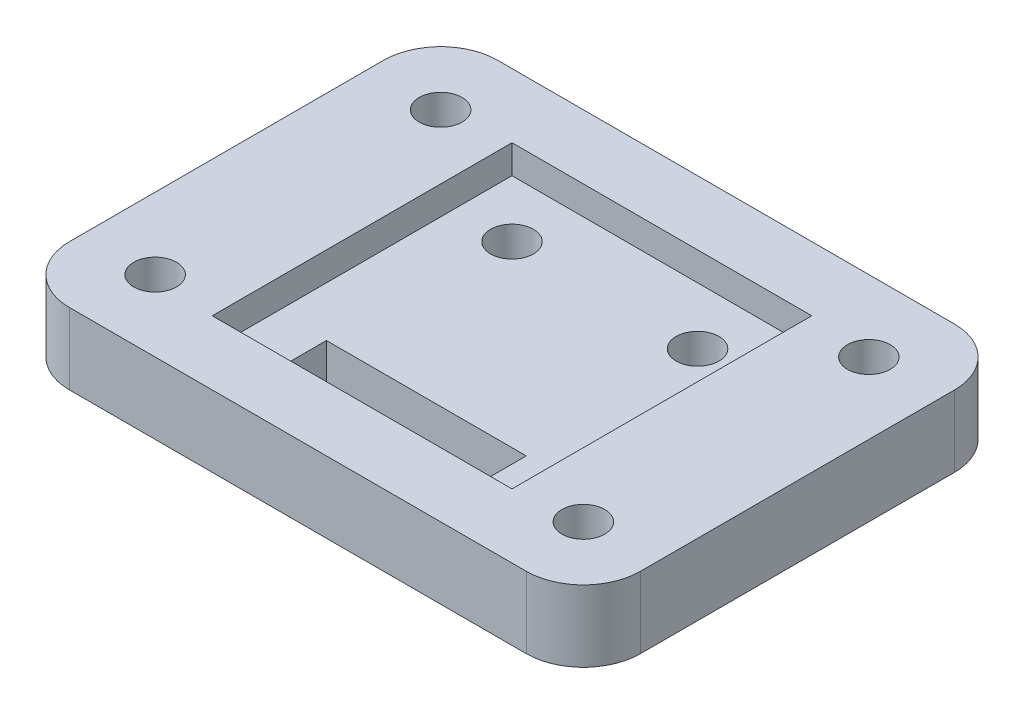
ISO-10303-21;
HEADER;
FILE_DESCRIPTION(('STEP AP214'),'2;1');
FILE_NAME('part.step','',(''),(''),'','','');
FILE_SCHEMA(('AUTOMOTIVE_DESIGN { 1 0 10303 214 1 1 1 1 }'));
ENDSEC;
DATA;
#1=APPLICATION_CONTEXT('core data for automotive mechanical design processes');
#2=APPLICATION_PROTOCOL_DEFINITION('international standard','automotive_design',2000,#1);
#3=PRODUCT_CONTEXT('',#1,'mechanical');
#4=PRODUCT('Part','Part','',(#3));
#5=PRODUCT_RELATED_PRODUCT_CATEGORY('part','',(#4));
#6=PRODUCT_DEFINITION_FORMATION('','',#4);
#7=PRODUCT_DEFINITION_CONTEXT('part definition',#1,'design');
#8=PRODUCT_DEFINITION('design','',#6,#7);
#9=PRODUCT_DEFINITION_SHAPE('','',#8);
#10=(LENGTH_UNIT() NAMED_UNIT(*) SI_UNIT(.MILLI.,.METRE.));
#11=(NAMED_UNIT(*) PLANE_ANGLE_UNIT() SI_UNIT($,.RADIAN.));
#12=(NAMED_UNIT(*) SI_UNIT($,.STERADIAN.) SOLID_ANGLE_UNIT());
#13=UNCERTAINTY_MEASURE_WITH_UNIT(LENGTH_MEASURE(1.E-05),#10,'distance_accuracy_value','');
#14=(GEOMETRIC_REPRESENTATION_CONTEXT(3) GLOBAL_UNCERTAINTY_ASSIGNED_CONTEXT((#13)) GLOBAL_UNIT_ASSIGNED_CONTEXT((#10,
#11,#12)) REPRESENTATION_CONTEXT('',''));
#15=CARTESIAN_POINT('',(0.,0.,0.));
#16=DIRECTION('',(0.,0.,1.));
#17=DIRECTION('',(1.,0.,0.));
#18=AXIS2_PLACEMENT_3D('',#15,#16,#17);
#19=CARTESIAN_POINT('',(0.,5.,0.));
#20=DIRECTION('',(1.,0.,0.));
#21=DIRECTION('',(0.,0.,-1.));
#22=AXIS2_PLACEMENT_3D('',#19,#20,#21);
#23=PLANE('',#22);
#24=DIRECTION('',(0.,0.,1.));
#25=VECTOR('',#24,1.);
#26=CARTESIAN_POINT('',(0.,5.,0.));
#27=LINE('',#26,#25);
#28=CARTESIAN_POINT('',(0.,5.,-26.));
#29=VERTEX_POINT('',#28);
#30=CARTESIAN_POINT('',(0.,5.,-4.));
#31=VERTEX_POINT('',#30);
#32=EDGE_CURVE('E220',#29,#31,#27,.T.);
#33=ORIENTED_EDGE('',*,*,#32,.F.);
#34=DIRECTION('',(0.,-1.,0.));
#35=VECTOR('',#34,1.);
#36=CARTESIAN_POINT('',(0.,5.,-26.));
#37=LINE('',#36,#35);
#38=CARTESIAN_POINT('',(0.,0.,-26.));
#39=VERTEX_POINT('',#38);
#40=EDGE_CURVE('E11',#29,#39,#37,.T.);
#41=ORIENTED_EDGE('',*,*,#40,.T.);
#42=DIRECTION('',(0.,0.,1.));
#43=VECTOR('',#42,1.);
#44=CARTESIAN_POINT('',(0.,0.,0.));
#45=LINE('',#44,#43);
#46=CARTESIAN_POINT('',(0.,0.,-4.));
#47=VERTEX_POINT('',#46);
#48=EDGE_CURVE('E213',#39,#47,#45,.T.);
#49=ORIENTED_EDGE('',*,*,#48,.T.);
#50=DIRECTION('',(0.,-1.,0.));
#51=VECTOR('',#50,1.);
#52=CARTESIAN_POINT('',(0.,5.,-4.));
#53=LINE('',#52,#51);
#54=EDGE_CURVE('E40',#47,#31,#53,.F.);
#55=ORIENTED_EDGE('',*,*,#54,.T.);
#56=EDGE_LOOP('',(#33,#41,#49,#55));
#57=FACE_BOUND('',#56,.T.);
#58=ADVANCED_FACE('F32',(#57),#23,.F.);
#59=CARTESIAN_POINT('',(0.,5.,0.));
#60=DIRECTION('',(0.,0.,-1.));
#61=DIRECTION('',(-1.,0.,0.));
#62=AXIS2_PLACEMENT_3D('',#59,#60,#61);
#63=PLANE('',#62);
#64=DIRECTION('',(1.,0.,0.));
#65=VECTOR('',#64,1.);
#66=CARTESIAN_POINT('',(0.,0.,0.));
#67=LINE('',#66,#65);
#68=CARTESIAN_POINT('',(4.,0.,0.));
#69=VERTEX_POINT('',#68);
#70=CARTESIAN_POINT('',(36.,0.,0.));
#71=VERTEX_POINT('',#70);
#72=EDGE_CURVE('E234',#69,#71,#67,.T.);
#73=ORIENTED_EDGE('',*,*,#72,.T.);
#74=DIRECTION('',(0.,-1.,0.));
#75=VECTOR('',#74,1.);
#76=CARTESIAN_POINT('',(36.,5.,0.));
#77=LINE('',#76,#75);
#78=CARTESIAN_POINT('',(36.,5.,0.));
#79=VERTEX_POINT('',#78);
#80=EDGE_CURVE('E47',#71,#79,#77,.F.);
#81=ORIENTED_EDGE('',*,*,#80,.T.);
#82=DIRECTION('',(1.,0.,0.));
#83=VECTOR('',#82,1.);
#84=CARTESIAN_POINT('',(0.,5.,0.));
#85=LINE('',#84,#83);
#86=CARTESIAN_POINT('',(4.,5.,0.));
#87=VERTEX_POINT('',#86);
#88=EDGE_CURVE('E222',#87,#79,#85,.T.);
#89=ORIENTED_EDGE('',*,*,#88,.F.);
#90=DIRECTION('',(0.,-1.,0.));
#91=VECTOR('',#90,1.);
#92=CARTESIAN_POINT('',(4.,5.,0.));
#93=LINE('',#92,#91);
#94=EDGE_CURVE('E265',#87,#69,#93,.T.);
#95=ORIENTED_EDGE('',*,*,#94,.T.);
#96=EDGE_LOOP('',(#73,#81,#89,#95));
#97=FACE_BOUND('',#96,.T.);
#98=ADVANCED_FACE('F278',(#97),#63,.F.);
#99=CARTESIAN_POINT('',(40.,5.,0.));
#100=DIRECTION('',(-1.,0.,0.));
#101=DIRECTION('',(0.,0.,1.));
#102=AXIS2_PLACEMENT_3D('',#99,#100,#101);
#103=PLANE('',#102);
#104=DIRECTION('',(0.,0.,-1.));
#105=VECTOR('',#104,1.);
#106=CARTESIAN_POINT('',(40.,0.,0.));
#107=LINE('',#106,#105);
#108=CARTESIAN_POINT('',(40.,0.,-4.));
#109=VERTEX_POINT('',#108);
#110=CARTESIAN_POINT('',(40.,0.,-26.));
#111=VERTEX_POINT('',#110);
#112=EDGE_CURVE('E236',#109,#111,#107,.T.);
#113=ORIENTED_EDGE('',*,*,#112,.T.);
#114=DIRECTION('',(0.,-1.,0.));
#115=VECTOR('',#114,1.);
#116=CARTESIAN_POINT('',(40.,5.,-26.));
#117=LINE('',#116,#115);
#118=CARTESIAN_POINT('',(40.,5.,-26.));
#119=VERTEX_POINT('',#118);
#120=EDGE_CURVE('E256',#111,#119,#117,.F.);
#121=ORIENTED_EDGE('',*,*,#120,.T.);
#122=DIRECTION('',(0.,0.,-1.));
#123=VECTOR('',#122,1.);
#124=CARTESIAN_POINT('',(40.,5.,0.));
#125=LINE('',#124,#123);
#126=CARTESIAN_POINT('',(40.,5.,-4.));
#127=VERTEX_POINT('',#126);
#128=EDGE_CURVE('E225',#127,#119,#125,.T.);
#129=ORIENTED_EDGE('',*,*,#128,.F.);
#130=DIRECTION('',(0.,-1.,0.));
#131=VECTOR('',#130,1.);
#132=CARTESIAN_POINT('',(40.,5.,-4.));
#133=LINE('',#132,#131);
#134=EDGE_CURVE('E253',#127,#109,#133,.T.);
#135=ORIENTED_EDGE('',*,*,#134,.T.);
#136=EDGE_LOOP('',(#113,#121,#129,#135));
#137=FACE_BOUND('',#136,.T.);
#138=ADVANCED_FACE('F287',(#137),#103,.F.);
#139=CARTESIAN_POINT('',(0.,5.,-30.));
#140=DIRECTION('',(0.,0.,1.));
#141=DIRECTION('',(1.,0.,0.));
#142=AXIS2_PLACEMENT_3D('',#139,#140,#141);
#143=PLANE('',#142);
#144=DIRECTION('',(-1.,0.,0.));
#145=VECTOR('',#144,1.);
#146=CARTESIAN_POINT('',(0.,5.,-30.));
#147=LINE('',#146,#145);
#148=CARTESIAN_POINT('',(36.,5.,-30.));
#149=VERTEX_POINT('',#148);
#150=CARTESIAN_POINT('',(4.,5.,-30.));
#151=VERTEX_POINT('',#150);
#152=EDGE_CURVE('E228',#149,#151,#147,.T.);
#153=ORIENTED_EDGE('',*,*,#152,.F.);
#154=DIRECTION('',(0.,-1.,0.));
#155=VECTOR('',#154,1.);
#156=CARTESIAN_POINT('',(36.,5.,-30.));
#157=LINE('',#156,#155);
#158=CARTESIAN_POINT('',(36.,0.,-30.));
#159=VERTEX_POINT('',#158);
#160=EDGE_CURVE('E242',#149,#159,#157,.T.);
#161=ORIENTED_EDGE('',*,*,#160,.T.);
#162=DIRECTION('',(-1.,0.,0.));
#163=VECTOR('',#162,1.);
#164=CARTESIAN_POINT('',(0.,0.,-30.));
#165=LINE('',#164,#163);
#166=CARTESIAN_POINT('',(4.,0.,-30.));
#167=VERTEX_POINT('',#166);
#168=EDGE_CURVE('E223',#159,#167,#165,.T.);
#169=ORIENTED_EDGE('',*,*,#168,.T.);
#170=DIRECTION('',(0.,-1.,0.));
#171=VECTOR('',#170,1.);
#172=CARTESIAN_POINT('',(4.,5.,-30.));
#173=LINE('',#172,#171);
#174=EDGE_CURVE('E231',#167,#151,#173,.F.);
#175=ORIENTED_EDGE('',*,*,#174,.T.);
#176=EDGE_LOOP('',(#153,#161,#169,#175));
#177=FACE_BOUND('',#176,.T.);
#178=ADVANCED_FACE('F295',(#177),#143,.F.);
#179=CARTESIAN_POINT('',(0.,5.,0.));
#180=DIRECTION('',(0.,-1.,0.));
#181=DIRECTION('',(0.,0.,-1.));
#182=AXIS2_PLACEMENT_3D('',#179,#180,#181);
#183=PLANE('',#182);
#184=CARTESIAN_POINT('',(5.,5.,-25.));
#185=DIRECTION('',(0.,1.,0.));
#186=DIRECTION('',(0.,0.,-1.));
#187=AXIS2_PLACEMENT_3D('',#184,#185,#186);
#188=CIRCLE('',#187,1.5);
#189=CARTESIAN_POINT('',(5.,5.,-26.5));
#190=VERTEX_POINT('',#189);
#191=EDGE_CURVE('E586',#190,#190,#188,.T.);
#192=ORIENTED_EDGE('',*,*,#191,.F.);
#193=EDGE_LOOP('',(#192));
#194=FACE_BOUND('',#193,.T.);
#195=CARTESIAN_POINT('',(35.,5.,-5.));
#196=DIRECTION('',(0.,1.,0.));
#197=DIRECTION('',(0.,0.,-1.));
#198=AXIS2_PLACEMENT_3D('',#195,#196,#197);
#199=CIRCLE('',#198,1.5);
#200=CARTESIAN_POINT('',(35.,5.,-6.50000000000001));
#201=VERTEX_POINT('',#200);
#202=EDGE_CURVE('E581',#201,#201,#199,.T.);
#203=ORIENTED_EDGE('',*,*,#202,.F.);
#204=EDGE_LOOP('',(#203));
#205=FACE_BOUND('',#204,.T.);
#206=CARTESIAN_POINT('',(35.,5.,-25.));
#207=DIRECTION('',(0.,1.,0.));
#208=DIRECTION('',(0.,0.,1.));
#209=AXIS2_PLACEMENT_3D('',#206,#207,#208);
#210=CIRCLE('',#209,1.5);
#211=CARTESIAN_POINT('',(35.,5.,-23.5));
#212=VERTEX_POINT('',#211);
#213=EDGE_CURVE('E582',#212,#212,#210,.T.);
#214=ORIENTED_EDGE('',*,*,#213,.F.);
#215=EDGE_LOOP('',(#214));
#216=FACE_BOUND('',#215,.T.);
#217=CARTESIAN_POINT('',(5.,5.,-5.));
#218=DIRECTION('',(0.,1.,0.));
#219=DIRECTION('',(0.,0.,1.));
#220=AXIS2_PLACEMENT_3D('',#217,#218,#219);
#221=CIRCLE('',#220,1.5);
#222=CARTESIAN_POINT('',(5.,5.,-3.5));
#223=VERTEX_POINT('',#222);
#224=EDGE_CURVE('E577',#223,#223,#221,.T.);
#225=ORIENTED_EDGE('',*,*,#224,.F.);
#226=EDGE_LOOP('',(#225));
#227=FACE_BOUND('',#226,.T.);
#228=DIRECTION('',(1.,0.,0.));
#229=VECTOR('',#228,1.);
#230=CARTESIAN_POINT('',(9.5,5.,-4.5));
#231=LINE('',#230,#229);
#232=CARTESIAN_POINT('',(9.5,5.,-4.5));
#233=VERTEX_POINT('',#232);
#234=CARTESIAN_POINT('',(30.5,5.,-4.5));
#235=VERTEX_POINT('',#234);
#236=EDGE_CURVE('E203',#233,#235,#231,.T.);
#237=ORIENTED_EDGE('',*,*,#236,.F.);
#238=DIRECTION('',(0.,0.,1.));
#239=VECTOR('',#238,1.);
#240=CARTESIAN_POINT('',(9.5,5.,-4.5));
#241=LINE('',#240,#239);
#242=CARTESIAN_POINT('',(9.5,5.,-25.5));
#243=VERTEX_POINT('',#242);
#244=EDGE_CURVE('E187',#243,#233,#241,.T.);
#245=ORIENTED_EDGE('',*,*,#244,.F.);
#246=DIRECTION('',(-1.,0.,0.));
#247=VECTOR('',#246,1.);
#248=CARTESIAN_POINT('',(9.5,5.,-25.5));
#249=LINE('',#248,#247);
#250=CARTESIAN_POINT('',(30.5,5.,-25.5));
#251=VERTEX_POINT('',#250);
#252=EDGE_CURVE('E192',#251,#243,#249,.T.);
#253=ORIENTED_EDGE('',*,*,#252,.F.);
#254=DIRECTION('',(0.,0.,-1.));
#255=VECTOR('',#254,1.);
#256=CARTESIAN_POINT('',(30.5,5.,-4.5));
#257=LINE('',#256,#255);
#258=EDGE_CURVE('E206',#235,#251,#257,.T.);
#259=ORIENTED_EDGE('',*,*,#258,.F.);
#260=EDGE_LOOP('',(#237,#245,#253,#259));
#261=FACE_BOUND('',#260,.T.);
#262=ORIENTED_EDGE('',*,*,#128,.T.);
#263=CARTESIAN_POINT('',(36.,5.,-26.));
#264=DIRECTION('',(0.,-1.,0.));
#265=DIRECTION('',(0.,0.,-1.));
#266=AXIS2_PLACEMENT_3D('',#263,#264,#265);
#267=CIRCLE('',#266,4.);
#268=EDGE_CURVE('E263',#119,#149,#267,.F.);
#269=ORIENTED_EDGE('',*,*,#268,.T.);
#270=ORIENTED_EDGE('',*,*,#152,.T.);
#271=CARTESIAN_POINT('',(4.,5.,-26.));
#272=DIRECTION('',(0.,-1.,0.));
#273=DIRECTION('',(0.,0.,-1.));
#274=AXIS2_PLACEMENT_3D('',#271,#272,#273);
#275=CIRCLE('',#274,4.);
#276=EDGE_CURVE('E259',#151,#29,#275,.F.);
#277=ORIENTED_EDGE('',*,*,#276,.T.);
#278=ORIENTED_EDGE('',*,*,#32,.T.);
#279=CARTESIAN_POINT('',(4.,5.,-4.));
#280=DIRECTION('',(0.,-1.,0.));
#281=DIRECTION('',(0.,0.,-1.));
#282=AXIS2_PLACEMENT_3D('',#279,#280,#281);
#283=CIRCLE('',#282,4.);
#284=EDGE_CURVE('E54',#31,#87,#283,.F.);
#285=ORIENTED_EDGE('',*,*,#284,.T.);
#286=ORIENTED_EDGE('',*,*,#88,.T.);
#287=CARTESIAN_POINT('',(36.,5.,-4.));
#288=DIRECTION('',(0.,-1.,0.));
#289=DIRECTION('',(0.,0.,-1.));
#290=AXIS2_PLACEMENT_3D('',#287,#288,#289);
#291=CIRCLE('',#290,4.);
#292=EDGE_CURVE('E261',#79,#127,#291,.F.);
#293=ORIENTED_EDGE('',*,*,#292,.T.);
#294=EDGE_LOOP('',(#262,#269,#270,#277,#278,#285,#286,#293));
#295=FACE_BOUND('',#294,.T.);
#296=ADVANCED_FACE('F274',(#194,#205,#216,#227,#261,#295),#183,.F.);
#297=CARTESIAN_POINT('',(0.,0.,0.));
#298=DIRECTION('',(0.,-1.,0.));
#299=DIRECTION('',(0.,0.,-1.));
#300=AXIS2_PLACEMENT_3D('',#297,#298,#299);
#301=PLANE('',#300);
#302=CARTESIAN_POINT('',(5.,0.,-25.));
#303=DIRECTION('',(0.,-1.,0.));
#304=DIRECTION('',(0.,0.,-1.));
#305=AXIS2_PLACEMENT_3D('',#302,#303,#304);
#306=CIRCLE('',#305,1.5);
#307=CARTESIAN_POINT('',(5.,0.,-26.5));
#308=VERTEX_POINT('',#307);
#309=EDGE_CURVE('E530',#308,#308,#306,.F.);
#310=ORIENTED_EDGE('',*,*,#309,.T.);
#311=EDGE_LOOP('',(#310));
#312=FACE_BOUND('',#311,.T.);
#313=CARTESIAN_POINT('',(35.,0.,-5.));
#314=DIRECTION('',(0.,-1.,0.));
#315=DIRECTION('',(0.,0.,-1.));
#316=AXIS2_PLACEMENT_3D('',#313,#314,#315);
#317=CIRCLE('',#316,1.5);
#318=CARTESIAN_POINT('',(35.,0.,-6.50000000000001));
#319=VERTEX_POINT('',#318);
#320=EDGE_CURVE('E534',#319,#319,#317,.F.);
#321=ORIENTED_EDGE('',*,*,#320,.T.);
#322=EDGE_LOOP('',(#321));
#323=FACE_BOUND('',#322,.T.);
#324=CARTESIAN_POINT('',(35.,0.,-25.));
#325=DIRECTION('',(0.,-1.,0.));
#326=DIRECTION('',(0.,0.,-1.));
#327=AXIS2_PLACEMENT_3D('',#324,#325,#326);
#328=CIRCLE('',#327,1.5);
#329=CARTESIAN_POINT('',(35.,0.,-26.5));
#330=VERTEX_POINT('',#329);
#331=EDGE_CURVE('E538',#330,#330,#328,.F.);
#332=ORIENTED_EDGE('',*,*,#331,.T.);
#333=EDGE_LOOP('',(#332));
#334=FACE_BOUND('',#333,.T.);
#335=CARTESIAN_POINT('',(5.,0.,-5.));
#336=DIRECTION('',(0.,-1.,0.));
#337=DIRECTION('',(0.,0.,-1.));
#338=AXIS2_PLACEMENT_3D('',#335,#336,#337);
#339=CIRCLE('',#338,1.5);
#340=CARTESIAN_POINT('',(5.,0.,-6.5));
#341=VERTEX_POINT('',#340);
#342=EDGE_CURVE('E542',#341,#341,#339,.F.);
#343=ORIENTED_EDGE('',*,*,#342,.T.);
#344=EDGE_LOOP('',(#343));
#345=FACE_BOUND('',#344,.T.);
#346=CARTESIAN_POINT('',(26.5,0.,-21.5));
#347=DIRECTION('',(0.,-1.,0.));
#348=DIRECTION('',(0.,0.,-1.));
#349=AXIS2_PLACEMENT_3D('',#346,#347,#348);
#350=CIRCLE('',#349,1.5);
#351=CARTESIAN_POINT('',(26.5,0.,-23.));
#352=VERTEX_POINT('',#351);
#353=EDGE_CURVE('E546',#352,#352,#350,.F.);
#354=ORIENTED_EDGE('',*,*,#353,.T.);
#355=EDGE_LOOP('',(#354));
#356=FACE_BOUND('',#355,.T.);
#357=CARTESIAN_POINT('',(13.5,0.,-21.5));
#358=DIRECTION('',(0.,-1.,0.));
#359=DIRECTION('',(0.,0.,-1.));
#360=AXIS2_PLACEMENT_3D('',#357,#358,#359);
#361=CIRCLE('',#360,1.5);
#362=CARTESIAN_POINT('',(13.5,0.,-23.));
#363=VERTEX_POINT('',#362);
#364=EDGE_CURVE('E549',#363,#363,#361,.F.);
#365=ORIENTED_EDGE('',*,*,#364,.T.);
#366=EDGE_LOOP('',(#365));
#367=FACE_BOUND('',#366,.T.);
#368=DIRECTION('',(1.,0.,0.));
#369=VECTOR('',#368,1.);
#370=CARTESIAN_POINT('',(13.,0.,-6.));
#371=LINE('',#370,#369);
#372=CARTESIAN_POINT('',(13.,0.,-6.));
#373=VERTEX_POINT('',#372);
#374=CARTESIAN_POINT('',(27.,0.,-6.));
#375=VERTEX_POINT('',#374);
#376=EDGE_CURVE('E161',#373,#375,#371,.T.);
#377=ORIENTED_EDGE('',*,*,#376,.T.);
#378=DIRECTION('',(0.,0.,-1.));
#379=VECTOR('',#378,1.);
#380=CARTESIAN_POINT('',(27.,0.,-6.));
#381=LINE('',#380,#379);
#382=CARTESIAN_POINT('',(27.,0.,-9.));
#383=VERTEX_POINT('',#382);
#384=EDGE_CURVE('E147',#375,#383,#381,.T.);
#385=ORIENTED_EDGE('',*,*,#384,.T.);
#386=DIRECTION('',(-1.,0.,0.));
#387=VECTOR('',#386,1.);
#388=CARTESIAN_POINT('',(13.,0.,-9.));
#389=LINE('',#388,#387);
#390=CARTESIAN_POINT('',(13.,0.,-9.));
#391=VERTEX_POINT('',#390);
#392=EDGE_CURVE('E181',#383,#391,#389,.T.);
#393=ORIENTED_EDGE('',*,*,#392,.T.);
#394=DIRECTION('',(0.,0.,1.));
#395=VECTOR('',#394,1.);
#396=CARTESIAN_POINT('',(13.,0.,-6.));
#397=LINE('',#396,#395);
#398=EDGE_CURVE('E169',#391,#373,#397,.T.);
#399=ORIENTED_EDGE('',*,*,#398,.T.);
#400=EDGE_LOOP('',(#377,#385,#393,#399));
#401=FACE_BOUND('',#400,.T.);
#402=ORIENTED_EDGE('',*,*,#168,.F.);
#403=CARTESIAN_POINT('',(36.,0.,-26.));
#404=DIRECTION('',(0.,-1.,0.));
#405=DIRECTION('',(0.,0.,-1.));
#406=AXIS2_PLACEMENT_3D('',#403,#404,#405);
#407=CIRCLE('',#406,4.);
#408=EDGE_CURVE('E251',#159,#111,#407,.T.);
#409=ORIENTED_EDGE('',*,*,#408,.T.);
#410=ORIENTED_EDGE('',*,*,#112,.F.);
#411=CARTESIAN_POINT('',(36.,0.,-4.));
#412=DIRECTION('',(0.,-1.,0.));
#413=DIRECTION('',(0.,0.,-1.));
#414=AXIS2_PLACEMENT_3D('',#411,#412,#413);
#415=CIRCLE('',#414,4.);
#416=EDGE_CURVE('E249',#109,#71,#415,.T.);
#417=ORIENTED_EDGE('',*,*,#416,.T.);
#418=ORIENTED_EDGE('',*,*,#72,.F.);
#419=CARTESIAN_POINT('',(4.,0.,-4.));
#420=DIRECTION('',(0.,-1.,0.));
#421=DIRECTION('',(0.,0.,-1.));
#422=AXIS2_PLACEMENT_3D('',#419,#420,#421);
#423=CIRCLE('',#422,4.);
#424=EDGE_CURVE('E245',#69,#47,#423,.T.);
#425=ORIENTED_EDGE('',*,*,#424,.T.);
#426=ORIENTED_EDGE('',*,*,#48,.F.);
#427=CARTESIAN_POINT('',(4.,0.,-26.));
#428=DIRECTION('',(0.,-1.,0.));
#429=DIRECTION('',(0.,0.,-1.));
#430=AXIS2_PLACEMENT_3D('',#427,#428,#429);
#431=CIRCLE('',#430,4.);
#432=EDGE_CURVE('E247',#39,#167,#431,.T.);
#433=ORIENTED_EDGE('',*,*,#432,.T.);
#434=EDGE_LOOP('',(#402,#409,#410,#417,#418,#425,#426,#433));
#435=FACE_BOUND('',#434,.T.);
#436=ADVANCED_FACE('F167',(#312,#323,#334,#345,#356,#367,#401,#435),#301,.T.);
#437=CARTESIAN_POINT('',(9.5,3.,-4.5));
#438=DIRECTION('',(-1.,0.,0.));
#439=DIRECTION('',(0.,0.,1.));
#440=AXIS2_PLACEMENT_3D('',#437,#438,#439);
#441=PLANE('',#440);
#442=ORIENTED_EDGE('',*,*,#244,.T.);
#443=DIRECTION('',(0.,1.,0.));
#444=VECTOR('',#443,1.);
#445=CARTESIAN_POINT('',(9.5,3.,-4.5));
#446=LINE('',#445,#444);
#447=CARTESIAN_POINT('',(9.5,3.,-4.5));
#448=VERTEX_POINT('',#447);
#449=EDGE_CURVE('E201',#448,#233,#446,.T.);
#450=ORIENTED_EDGE('',*,*,#449,.F.);
#451=DIRECTION('',(0.,0.,1.));
#452=VECTOR('',#451,1.);
#453=CARTESIAN_POINT('',(9.5,3.,-4.5));
#454=LINE('',#453,#452);
#455=CARTESIAN_POINT('',(9.5,3.,-25.5));
#456=VERTEX_POINT('',#455);
#457=EDGE_CURVE('E188',#456,#448,#454,.T.);
#458=ORIENTED_EDGE('',*,*,#457,.F.);
#459=DIRECTION('',(0.,1.,0.));
#460=VECTOR('',#459,1.);
#461=CARTESIAN_POINT('',(9.5,3.,-25.5));
#462=LINE('',#461,#460);
#463=EDGE_CURVE('E211',#456,#243,#462,.T.);
#464=ORIENTED_EDGE('',*,*,#463,.T.);
#465=EDGE_LOOP('',(#442,#450,#458,#464));
#466=FACE_BOUND('',#465,.T.);
#467=ADVANCED_FACE('F366',(#466),#441,.F.);
#468=CARTESIAN_POINT('',(9.5,3.,-25.5));
#469=DIRECTION('',(0.,0.,-1.));
#470=DIRECTION('',(-1.,0.,0.));
#471=AXIS2_PLACEMENT_3D('',#468,#469,#470);
#472=PLANE('',#471);
#473=ORIENTED_EDGE('',*,*,#252,.T.);
#474=ORIENTED_EDGE('',*,*,#463,.F.);
#475=DIRECTION('',(-1.,0.,0.));
#476=VECTOR('',#475,1.);
#477=CARTESIAN_POINT('',(9.5,3.,-25.5));
#478=LINE('',#477,#476);
#479=CARTESIAN_POINT('',(30.5,3.,-25.5));
#480=VERTEX_POINT('',#479);
#481=EDGE_CURVE('E198',#480,#456,#478,.T.);
#482=ORIENTED_EDGE('',*,*,#481,.F.);
#483=DIRECTION('',(0.,1.,0.));
#484=VECTOR('',#483,1.);
#485=CARTESIAN_POINT('',(30.5,3.,-25.5));
#486=LINE('',#485,#484);
#487=EDGE_CURVE('E214',#480,#251,#486,.T.);
#488=ORIENTED_EDGE('',*,*,#487,.T.);
#489=EDGE_LOOP('',(#473,#474,#482,#488));
#490=FACE_BOUND('',#489,.T.);
#491=ADVANCED_FACE('F362',(#490),#472,.F.);
#492=CARTESIAN_POINT('',(30.5,3.,-4.5));
#493=DIRECTION('',(1.,0.,0.));
#494=DIRECTION('',(0.,0.,-1.));
#495=AXIS2_PLACEMENT_3D('',#492,#493,#494);
#496=PLANE('',#495);
#497=ORIENTED_EDGE('',*,*,#258,.T.);
#498=ORIENTED_EDGE('',*,*,#487,.F.);
#499=DIRECTION('',(0.,0.,-1.));
#500=VECTOR('',#499,1.);
#501=CARTESIAN_POINT('',(30.5,3.,-4.5));
#502=LINE('',#501,#500);
#503=CARTESIAN_POINT('',(30.5,3.,-4.5));
#504=VERTEX_POINT('',#503);
#505=EDGE_CURVE('E195',#504,#480,#502,.T.);
#506=ORIENTED_EDGE('',*,*,#505,.F.);
#507=DIRECTION('',(0.,1.,0.));
#508=VECTOR('',#507,1.);
#509=CARTESIAN_POINT('',(30.5,3.,-4.5));
#510=LINE('',#509,#508);
#511=EDGE_CURVE('E216',#504,#235,#510,.T.);
#512=ORIENTED_EDGE('',*,*,#511,.T.);
#513=EDGE_LOOP('',(#497,#498,#506,#512));
#514=FACE_BOUND('',#513,.T.);
#515=ADVANCED_FACE('F365',(#514),#496,.F.);
#516=CARTESIAN_POINT('',(9.5,3.,-4.5));
#517=DIRECTION('',(0.,0.,1.));
#518=DIRECTION('',(1.,0.,0.));
#519=AXIS2_PLACEMENT_3D('',#516,#517,#518);
#520=PLANE('',#519);
#521=ORIENTED_EDGE('',*,*,#236,.T.);
#522=ORIENTED_EDGE('',*,*,#511,.F.);
#523=DIRECTION('',(1.,0.,0.));
#524=VECTOR('',#523,1.);
#525=CARTESIAN_POINT('',(9.5,3.,-4.5));
#526=LINE('',#525,#524);
#527=EDGE_CURVE('E191',#448,#504,#526,.T.);
#528=ORIENTED_EDGE('',*,*,#527,.F.);
#529=ORIENTED_EDGE('',*,*,#449,.T.);
#530=EDGE_LOOP('',(#521,#522,#528,#529));
#531=FACE_BOUND('',#530,.T.);
#532=ADVANCED_FACE('F360',(#531),#520,.F.);
#533=CARTESIAN_POINT('',(0.,3.,0.));
#534=DIRECTION('',(0.,-1.,0.));
#535=DIRECTION('',(0.,0.,-1.));
#536=AXIS2_PLACEMENT_3D('',#533,#534,#535);
#537=PLANE('',#536);
#538=CARTESIAN_POINT('',(26.5,3.,-21.5));
#539=DIRECTION('',(0.,1.,0.));
#540=DIRECTION('',(0.,0.,1.));
#541=AXIS2_PLACEMENT_3D('',#538,#539,#540);
#542=CIRCLE('',#541,1.5);
#543=CARTESIAN_POINT('',(26.5,3.,-20.));
#544=VERTEX_POINT('',#543);
#545=EDGE_CURVE('E573',#544,#544,#542,.T.);
#546=ORIENTED_EDGE('',*,*,#545,.F.);
#547=EDGE_LOOP('',(#546));
#548=FACE_BOUND('',#547,.T.);
#549=CARTESIAN_POINT('',(13.5,3.,-21.5));
#550=DIRECTION('',(0.,1.,0.));
#551=DIRECTION('',(0.,0.,1.));
#552=AXIS2_PLACEMENT_3D('',#549,#550,#551);
#553=CIRCLE('',#552,1.5);
#554=CARTESIAN_POINT('',(13.5,3.,-20.));
#555=VERTEX_POINT('',#554);
#556=EDGE_CURVE('E551',#555,#555,#553,.T.);
#557=ORIENTED_EDGE('',*,*,#556,.F.);
#558=EDGE_LOOP('',(#557));
#559=FACE_BOUND('',#558,.T.);
#560=DIRECTION('',(0.,0.,-1.));
#561=VECTOR('',#560,1.);
#562=CARTESIAN_POINT('',(27.,3.,-6.));
#563=LINE('',#562,#561);
#564=CARTESIAN_POINT('',(27.,3.,-6.));
#565=VERTEX_POINT('',#564);
#566=CARTESIAN_POINT('',(27.,3.,-9.));
#567=VERTEX_POINT('',#566);
#568=EDGE_CURVE('E172',#565,#567,#563,.T.);
#569=ORIENTED_EDGE('',*,*,#568,.F.);
#570=DIRECTION('',(1.,0.,0.));
#571=VECTOR('',#570,1.);
#572=CARTESIAN_POINT('',(13.,3.,-6.));
#573=LINE('',#572,#571);
#574=CARTESIAN_POINT('',(13.,3.,-6.));
#575=VERTEX_POINT('',#574);
#576=EDGE_CURVE('E164',#575,#565,#573,.T.);
#577=ORIENTED_EDGE('',*,*,#576,.F.);
#578=DIRECTION('',(0.,0.,1.));
#579=VECTOR('',#578,1.);
#580=CARTESIAN_POINT('',(13.,3.,-6.));
#581=LINE('',#580,#579);
#582=CARTESIAN_POINT('',(13.,3.,-9.));
#583=VERTEX_POINT('',#582);
#584=EDGE_CURVE('E176',#583,#575,#581,.T.);
#585=ORIENTED_EDGE('',*,*,#584,.F.);
#586=DIRECTION('',(-1.,0.,0.));
#587=VECTOR('',#586,1.);
#588=CARTESIAN_POINT('',(13.,3.,-9.));
#589=LINE('',#588,#587);
#590=EDGE_CURVE('E170',#567,#583,#589,.T.);
#591=ORIENTED_EDGE('',*,*,#590,.F.);
#592=EDGE_LOOP('',(#569,#577,#585,#591));
#593=FACE_BOUND('',#592,.T.);
#594=ORIENTED_EDGE('',*,*,#457,.T.);
#595=ORIENTED_EDGE('',*,*,#527,.T.);
#596=ORIENTED_EDGE('',*,*,#505,.T.);
#597=ORIENTED_EDGE('',*,*,#481,.T.);
#598=EDGE_LOOP('',(#594,#595,#596,#597));
#599=FACE_BOUND('',#598,.T.);
#600=ADVANCED_FACE('F357',(#548,#559,#593,#599),#537,.F.);
#601=CARTESIAN_POINT('',(13.,-14.3178210632764,-6.));
#602=DIRECTION('',(0.,0.,1.));
#603=DIRECTION('',(1.,0.,0.));
#604=AXIS2_PLACEMENT_3D('',#601,#602,#603);
#605=PLANE('',#604);
#606=DIRECTION('',(0.,1.,0.));
#607=VECTOR('',#606,1.);
#608=CARTESIAN_POINT('',(13.,-14.3178210632764,-6.));
#609=LINE('',#608,#607);
#610=EDGE_CURVE('E179',#373,#575,#609,.T.);
#611=ORIENTED_EDGE('',*,*,#610,.T.);
#612=ORIENTED_EDGE('',*,*,#576,.T.);
#613=DIRECTION('',(0.,1.,0.));
#614=VECTOR('',#613,1.);
#615=CARTESIAN_POINT('',(27.,-14.3178210632764,-6.));
#616=LINE('',#615,#614);
#617=EDGE_CURVE('E151',#375,#565,#616,.T.);
#618=ORIENTED_EDGE('',*,*,#617,.F.);
#619=ORIENTED_EDGE('',*,*,#376,.F.);
#620=EDGE_LOOP('',(#611,#612,#618,#619));
#621=FACE_BOUND('',#620,.T.);
#622=ADVANCED_FACE('F160',(#621),#605,.F.);
#623=CARTESIAN_POINT('',(27.,-14.3178210632764,-6.));
#624=DIRECTION('',(1.,0.,0.));
#625=DIRECTION('',(0.,0.,-1.));
#626=AXIS2_PLACEMENT_3D('',#623,#624,#625);
#627=PLANE('',#626);
#628=ORIENTED_EDGE('',*,*,#617,.T.);
#629=ORIENTED_EDGE('',*,*,#568,.T.);
#630=DIRECTION('',(0.,1.,0.));
#631=VECTOR('',#630,1.);
#632=CARTESIAN_POINT('',(27.,-14.3178210632764,-9.));
#633=LINE('',#632,#631);
#634=EDGE_CURVE('E153',#383,#567,#633,.T.);
#635=ORIENTED_EDGE('',*,*,#634,.F.);
#636=ORIENTED_EDGE('',*,*,#384,.F.);
#637=EDGE_LOOP('',(#628,#629,#635,#636));
#638=FACE_BOUND('',#637,.T.);
#639=ADVANCED_FACE('F149',(#638),#627,.F.);
#640=CARTESIAN_POINT('',(13.,-14.3178210632764,-9.));
#641=DIRECTION('',(0.,0.,-1.));
#642=DIRECTION('',(-1.,0.,0.));
#643=AXIS2_PLACEMENT_3D('',#640,#641,#642);
#644=PLANE('',#643);
#645=ORIENTED_EDGE('',*,*,#634,.T.);
#646=ORIENTED_EDGE('',*,*,#590,.T.);
#647=DIRECTION('',(0.,1.,0.));
#648=VECTOR('',#647,1.);
#649=CARTESIAN_POINT('',(13.,-14.3178210632764,-9.));
#650=LINE('',#649,#648);
#651=EDGE_CURVE('E180',#391,#583,#650,.T.);
#652=ORIENTED_EDGE('',*,*,#651,.F.);
#653=ORIENTED_EDGE('',*,*,#392,.F.);
#654=EDGE_LOOP('',(#645,#646,#652,#653));
#655=FACE_BOUND('',#654,.T.);
#656=ADVANCED_FACE('F348',(#655),#644,.F.);
#657=CARTESIAN_POINT('',(13.,-14.3178210632764,-6.));
#658=DIRECTION('',(-1.,0.,0.));
#659=DIRECTION('',(0.,0.,1.));
#660=AXIS2_PLACEMENT_3D('',#657,#658,#659);
#661=PLANE('',#660);
#662=ORIENTED_EDGE('',*,*,#651,.T.);
#663=ORIENTED_EDGE('',*,*,#584,.T.);
#664=ORIENTED_EDGE('',*,*,#610,.F.);
#665=ORIENTED_EDGE('',*,*,#398,.F.);
#666=EDGE_LOOP('',(#662,#663,#664,#665));
#667=FACE_BOUND('',#666,.T.);
#668=ADVANCED_FACE('F344',(#667),#661,.F.);
#669=CARTESIAN_POINT('',(13.5,-4.24264068711929,-21.5));
#670=DIRECTION('',(0.,1.,0.));
#671=DIRECTION('',(0.,0.,1.));
#672=AXIS2_PLACEMENT_3D('',#669,#670,#671);
#673=CYLINDRICAL_SURFACE('',#672,1.5);
#674=ORIENTED_EDGE('',*,*,#556,.T.);
#675=EDGE_LOOP('',(#674));
#676=FACE_BOUND('',#675,.T.);
#677=ORIENTED_EDGE('',*,*,#364,.F.);
#678=EDGE_LOOP('',(#677));
#679=FACE_BOUND('',#678,.T.);
#680=ADVANCED_FACE('F340',(#676,#679),#673,.F.);
#681=CARTESIAN_POINT('',(26.5,-4.24264068711929,-21.5));
#682=DIRECTION('',(0.,1.,0.));
#683=DIRECTION('',(0.,0.,1.));
#684=AXIS2_PLACEMENT_3D('',#681,#682,#683);
#685=CYLINDRICAL_SURFACE('',#684,1.5);
#686=ORIENTED_EDGE('',*,*,#545,.T.);
#687=EDGE_LOOP('',(#686));
#688=FACE_BOUND('',#687,.T.);
#689=ORIENTED_EDGE('',*,*,#353,.F.);
#690=EDGE_LOOP('',(#689));
#691=FACE_BOUND('',#690,.T.);
#692=ADVANCED_FACE('F336',(#688,#691),#685,.F.);
#693=CARTESIAN_POINT('',(5.,-4.24264068711929,-5.));
#694=DIRECTION('',(0.,1.,0.));
#695=DIRECTION('',(0.,0.,1.));
#696=AXIS2_PLACEMENT_3D('',#693,#694,#695);
#697=CYLINDRICAL_SURFACE('',#696,1.5);
#698=ORIENTED_EDGE('',*,*,#224,.T.);
#699=EDGE_LOOP('',(#698));
#700=FACE_BOUND('',#699,.T.);
#701=ORIENTED_EDGE('',*,*,#342,.F.);
#702=EDGE_LOOP('',(#701));
#703=FACE_BOUND('',#702,.T.);
#704=ADVANCED_FACE('F332',(#700,#703),#697,.F.);
#705=CARTESIAN_POINT('',(35.,-4.24264068711929,-25.));
#706=DIRECTION('',(0.,1.,0.));
#707=DIRECTION('',(0.,0.,1.));
#708=AXIS2_PLACEMENT_3D('',#705,#706,#707);
#709=CYLINDRICAL_SURFACE('',#708,1.5);
#710=ORIENTED_EDGE('',*,*,#213,.T.);
#711=EDGE_LOOP('',(#710));
#712=FACE_BOUND('',#711,.T.);
#713=ORIENTED_EDGE('',*,*,#331,.F.);
#714=EDGE_LOOP('',(#713));
#715=FACE_BOUND('',#714,.T.);
#716=ADVANCED_FACE('F324',(#712,#715),#709,.F.);
#717=CARTESIAN_POINT('',(35.,-4.24264068711929,-5.));
#718=DIRECTION('',(0.,1.,0.));
#719=DIRECTION('',(0.,0.,1.));
#720=AXIS2_PLACEMENT_3D('',#717,#718,#719);
#721=CYLINDRICAL_SURFACE('',#720,1.5);
#722=ORIENTED_EDGE('',*,*,#202,.T.);
#723=EDGE_LOOP('',(#722));
#724=FACE_BOUND('',#723,.T.);
#725=ORIENTED_EDGE('',*,*,#320,.F.);
#726=EDGE_LOOP('',(#725));
#727=FACE_BOUND('',#726,.T.);
#728=ADVANCED_FACE('F319',(#724,#727),#721,.F.);
#729=CARTESIAN_POINT('',(5.,-4.24264068711929,-25.));
#730=DIRECTION('',(0.,1.,0.));
#731=DIRECTION('',(0.,0.,1.));
#732=AXIS2_PLACEMENT_3D('',#729,#730,#731);
#733=CYLINDRICAL_SURFACE('',#732,1.5);
#734=ORIENTED_EDGE('',*,*,#191,.T.);
#735=EDGE_LOOP('',(#734));
#736=FACE_BOUND('',#735,.T.);
#737=ORIENTED_EDGE('',*,*,#309,.F.);
#738=EDGE_LOOP('',(#737));
#739=FACE_BOUND('',#738,.T.);
#740=ADVANCED_FACE('F315',(#736,#739),#733,.F.);
#741=CARTESIAN_POINT('',(36.,5.,-26.));
#742=DIRECTION('',(0.,-1.,0.));
#743=DIRECTION('',(0.,0.,-1.));
#744=AXIS2_PLACEMENT_3D('',#741,#742,#743);
#745=CYLINDRICAL_SURFACE('',#744,4.);
#746=ORIENTED_EDGE('',*,*,#268,.F.);
#747=ORIENTED_EDGE('',*,*,#120,.F.);
#748=ORIENTED_EDGE('',*,*,#408,.F.);
#749=ORIENTED_EDGE('',*,*,#160,.F.);
#750=EDGE_LOOP('',(#746,#747,#748,#749));
#751=FACE_BOUND('',#750,.T.);
#752=ADVANCED_FACE('F293',(#751),#745,.T.);
#753=CARTESIAN_POINT('',(36.,5.,-4.));
#754=DIRECTION('',(0.,-1.,0.));
#755=DIRECTION('',(0.,0.,-1.));
#756=AXIS2_PLACEMENT_3D('',#753,#754,#755);
#757=CYLINDRICAL_SURFACE('',#756,4.);
#758=ORIENTED_EDGE('',*,*,#292,.F.);
#759=ORIENTED_EDGE('',*,*,#80,.F.);
#760=ORIENTED_EDGE('',*,*,#416,.F.);
#761=ORIENTED_EDGE('',*,*,#134,.F.);
#762=EDGE_LOOP('',(#758,#759,#760,#761));
#763=FACE_BOUND('',#762,.T.);
#764=ADVANCED_FACE('F284',(#763),#757,.T.);
#765=CARTESIAN_POINT('',(4.,5.,-26.));
#766=DIRECTION('',(0.,-1.,0.));
#767=DIRECTION('',(0.,0.,-1.));
#768=AXIS2_PLACEMENT_3D('',#765,#766,#767);
#769=CYLINDRICAL_SURFACE('',#768,4.);
#770=ORIENTED_EDGE('',*,*,#276,.F.);
#771=ORIENTED_EDGE('',*,*,#174,.F.);
#772=ORIENTED_EDGE('',*,*,#432,.F.);
#773=ORIENTED_EDGE('',*,*,#40,.F.);
#774=EDGE_LOOP('',(#770,#771,#772,#773));
#775=FACE_BOUND('',#774,.T.);
#776=ADVANCED_FACE('F298',(#775),#769,.T.);
#777=CARTESIAN_POINT('',(4.,5.,-4.));
#778=DIRECTION('',(0.,-1.,0.));
#779=DIRECTION('',(0.,0.,-1.));
#780=AXIS2_PLACEMENT_3D('',#777,#778,#779);
#781=CYLINDRICAL_SURFACE('',#780,4.);
#782=ORIENTED_EDGE('',*,*,#284,.F.);
#783=ORIENTED_EDGE('',*,*,#54,.F.);
#784=ORIENTED_EDGE('',*,*,#424,.F.);
#785=ORIENTED_EDGE('',*,*,#94,.F.);
#786=EDGE_LOOP('',(#782,#783,#784,#785));
#787=FACE_BOUND('',#786,.T.);
#788=ADVANCED_FACE('F34',(#787),#781,.T.);
#789=CLOSED_SHELL('',(#58,#98,#138,#178,#296,#436,#467,#491,#515,#532,#600,#622,#639,#656,#668,
#680,#692,#704,#716,#728,#740,#752,#764,#776,#788));
#790=MANIFOLD_SOLID_BREP('B2',#789);
#791=ADVANCED_BREP_SHAPE_REPRESENTATION('',(#18,#790),#14);
#792=SHAPE_DEFINITION_REPRESENTATION(#9,#791);
ENDSEC;
END-ISO-10303-21;
